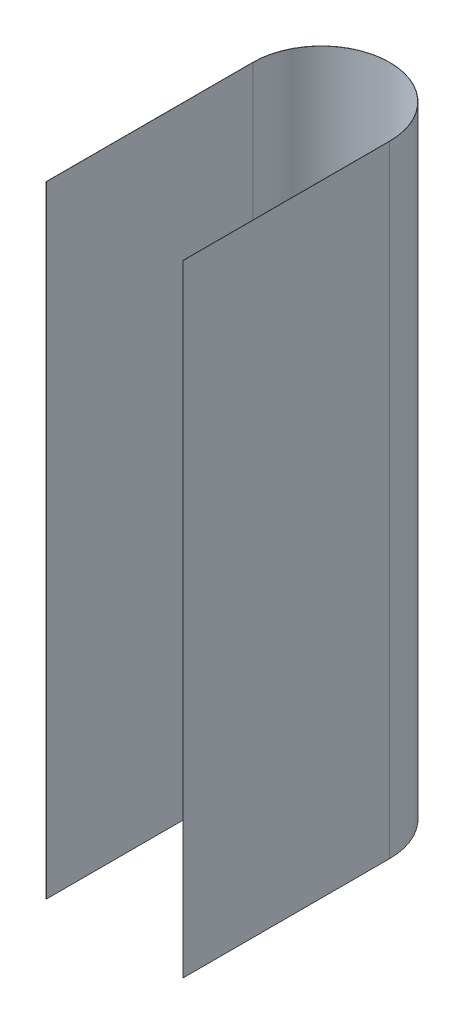
ISO-10303-21;
HEADER;
FILE_DESCRIPTION(('STEP AP214'),'2;1');
FILE_NAME('part.step','',(''),(''),'','','');
FILE_SCHEMA(('AUTOMOTIVE_DESIGN { 1 0 10303 214 1 1 1 1 }'));
ENDSEC;
DATA;
#1=APPLICATION_CONTEXT('core data for automotive mechanical design processes');
#2=APPLICATION_PROTOCOL_DEFINITION('international standard','automotive_design',2000,#1);
#3=PRODUCT_CONTEXT('',#1,'mechanical');
#4=PRODUCT('Part','Part','',(#3));
#5=PRODUCT_RELATED_PRODUCT_CATEGORY('part','',(#4));
#6=PRODUCT_DEFINITION_FORMATION('','',#4);
#7=PRODUCT_DEFINITION_CONTEXT('part definition',#1,'design');
#8=PRODUCT_DEFINITION('design','',#6,#7);
#9=PRODUCT_DEFINITION_SHAPE('','',#8);
#10=(LENGTH_UNIT() NAMED_UNIT(*) SI_UNIT(.MILLI.,.METRE.));
#11=(NAMED_UNIT(*) PLANE_ANGLE_UNIT() SI_UNIT($,.RADIAN.));
#12=(NAMED_UNIT(*) SI_UNIT($,.STERADIAN.) SOLID_ANGLE_UNIT());
#13=UNCERTAINTY_MEASURE_WITH_UNIT(LENGTH_MEASURE(1.E-05),#10,'distance_accuracy_value','');
#14=(GEOMETRIC_REPRESENTATION_CONTEXT(3) GLOBAL_UNCERTAINTY_ASSIGNED_CONTEXT((#13)) GLOBAL_UNIT_ASSIGNED_CONTEXT((#10,
#11,#12)) REPRESENTATION_CONTEXT('',''));
#15=CARTESIAN_POINT('',(0.,0.,0.));
#16=DIRECTION('',(0.,0.,1.));
#17=DIRECTION('',(1.,0.,0.));
#18=AXIS2_PLACEMENT_3D('',#15,#16,#17);
#19=CARTESIAN_POINT('',(33.,300.5,0.));
#20=DIRECTION('',(0.,-1.,0.));
#21=DIRECTION('',(0.,0.,-1.));
#22=AXIS2_PLACEMENT_3D('',#19,#20,#21);
#23=CYLINDRICAL_SURFACE('',#22,33.);
#24=CARTESIAN_POINT('',(33.,0.,0.));
#25=DIRECTION('',(0.,-1.,0.));
#26=DIRECTION('',(0.,0.,-1.));
#27=AXIS2_PLACEMENT_3D('',#24,#25,#26);
#28=CIRCLE('',#27,33.);
#29=CARTESIAN_POINT('',(0.,0.,0.));
#30=VERTEX_POINT('',#29);
#31=CARTESIAN_POINT('',(66.,0.,0.));
#32=VERTEX_POINT('',#31);
#33=EDGE_CURVE('E129',#30,#32,#28,.T.);
#34=ORIENTED_EDGE('',*,*,#33,.T.);
#35=DIRECTION('',(0.,-1.,0.));
#36=VECTOR('',#35,1.);
#37=CARTESIAN_POINT('',(66.,300.5,0.));
#38=LINE('',#37,#36);
#39=CARTESIAN_POINT('',(66.,300.5,0.));
#40=VERTEX_POINT('',#39);
#41=EDGE_CURVE('E11',#40,#32,#38,.T.);
#42=ORIENTED_EDGE('',*,*,#41,.F.);
#43=CARTESIAN_POINT('',(33.,300.5,0.));
#44=DIRECTION('',(0.,-1.,0.));
#45=DIRECTION('',(0.,0.,-1.));
#46=AXIS2_PLACEMENT_3D('',#43,#44,#45);
#47=CIRCLE('',#46,33.);
#48=CARTESIAN_POINT('',(0.,300.5,0.));
#49=VERTEX_POINT('',#48);
#50=EDGE_CURVE('E143',#49,#40,#47,.T.);
#51=ORIENTED_EDGE('',*,*,#50,.F.);
#52=DIRECTION('',(0.,-1.,0.));
#53=VECTOR('',#52,1.);
#54=CARTESIAN_POINT('',(0.,300.5,0.));
#55=LINE('',#54,#53);
#56=EDGE_CURVE('E125',#49,#30,#55,.T.);
#57=ORIENTED_EDGE('',*,*,#56,.T.);
#58=EDGE_LOOP('',(#34,#42,#51,#57));
#59=FACE_BOUND('',#58,.T.);
#60=ADVANCED_FACE('F33',(#59),#23,.F.);
#61=CARTESIAN_POINT('',(66.,300.5,0.));
#62=DIRECTION('',(1.,0.,0.));
#63=DIRECTION('',(0.,0.,-1.));
#64=AXIS2_PLACEMENT_3D('',#61,#62,#63);
#65=PLANE('',#64);
#66=DIRECTION('',(0.,0.,1.));
#67=VECTOR('',#66,1.);
#68=CARTESIAN_POINT('',(66.,0.,0.));
#69=LINE('',#68,#67);
#70=CARTESIAN_POINT('',(66.,0.,100.));
#71=VERTEX_POINT('',#70);
#72=EDGE_CURVE('E132',#32,#71,#69,.T.);
#73=ORIENTED_EDGE('',*,*,#72,.T.);
#74=DIRECTION('',(0.,-1.,0.));
#75=VECTOR('',#74,1.);
#76=CARTESIAN_POINT('',(66.,300.5,100.));
#77=LINE('',#76,#75);
#78=CARTESIAN_POINT('',(66.,300.5,100.));
#79=VERTEX_POINT('',#78);
#80=EDGE_CURVE('E41',#79,#71,#77,.T.);
#81=ORIENTED_EDGE('',*,*,#80,.F.);
#82=DIRECTION('',(0.,0.,1.));
#83=VECTOR('',#82,1.);
#84=CARTESIAN_POINT('',(66.,300.5,0.));
#85=LINE('',#84,#83);
#86=EDGE_CURVE('E92',#40,#79,#85,.T.);
#87=ORIENTED_EDGE('',*,*,#86,.F.);
#88=ORIENTED_EDGE('',*,*,#41,.T.);
#89=EDGE_LOOP('',(#73,#81,#87,#88));
#90=FACE_BOUND('',#89,.T.);
#91=ADVANCED_FACE('F178',(#90),#65,.F.);
#92=CARTESIAN_POINT('',(66.1,300.5,100.));
#93=DIRECTION('',(0.,0.,-1.));
#94=DIRECTION('',(-1.,0.,0.));
#95=AXIS2_PLACEMENT_3D('',#92,#93,#94);
#96=PLANE('',#95);
#97=DIRECTION('',(1.,0.,0.));
#98=VECTOR('',#97,1.);
#99=CARTESIAN_POINT('',(66.1,0.,100.));
#100=LINE('',#99,#98);
#101=CARTESIAN_POINT('',(66.1,0.,100.));
#102=VERTEX_POINT('',#101);
#103=EDGE_CURVE('E134',#71,#102,#100,.T.);
#104=ORIENTED_EDGE('',*,*,#103,.T.);
#105=DIRECTION('',(0.,-1.,0.));
#106=VECTOR('',#105,1.);
#107=CARTESIAN_POINT('',(66.1,300.5,100.));
#108=LINE('',#107,#106);
#109=CARTESIAN_POINT('',(66.1,300.5,100.));
#110=VERTEX_POINT('',#109);
#111=EDGE_CURVE('E150',#110,#102,#108,.T.);
#112=ORIENTED_EDGE('',*,*,#111,.F.);
#113=DIRECTION('',(1.,0.,0.));
#114=VECTOR('',#113,1.);
#115=CARTESIAN_POINT('',(66.1,300.5,100.));
#116=LINE('',#115,#114);
#117=EDGE_CURVE('E158',#79,#110,#116,.T.);
#118=ORIENTED_EDGE('',*,*,#117,.F.);
#119=ORIENTED_EDGE('',*,*,#80,.T.);
#120=EDGE_LOOP('',(#104,#112,#118,#119));
#121=FACE_BOUND('',#120,.T.);
#122=ADVANCED_FACE('F156',(#121),#96,.F.);
#123=CARTESIAN_POINT('',(66.1,300.5,0.));
#124=DIRECTION('',(-1.,0.,0.));
#125=DIRECTION('',(0.,0.,1.));
#126=AXIS2_PLACEMENT_3D('',#123,#124,#125);
#127=PLANE('',#126);
#128=DIRECTION('',(0.,0.,-1.));
#129=VECTOR('',#128,1.);
#130=CARTESIAN_POINT('',(66.1,0.,0.));
#131=LINE('',#130,#129);
#132=CARTESIAN_POINT('',(66.1,0.,0.));
#133=VERTEX_POINT('',#132);
#134=EDGE_CURVE('E136',#102,#133,#131,.T.);
#135=ORIENTED_EDGE('',*,*,#134,.T.);
#136=DIRECTION('',(0.,-1.,0.));
#137=VECTOR('',#136,1.);
#138=CARTESIAN_POINT('',(66.1,300.5,0.));
#139=LINE('',#138,#137);
#140=CARTESIAN_POINT('',(66.1,300.5,0.));
#141=VERTEX_POINT('',#140);
#142=EDGE_CURVE('E147',#141,#133,#139,.T.);
#143=ORIENTED_EDGE('',*,*,#142,.F.);
#144=DIRECTION('',(0.,0.,-1.));
#145=VECTOR('',#144,1.);
#146=CARTESIAN_POINT('',(66.1,300.5,0.));
#147=LINE('',#146,#145);
#148=EDGE_CURVE('E170',#110,#141,#147,.T.);
#149=ORIENTED_EDGE('',*,*,#148,.F.);
#150=ORIENTED_EDGE('',*,*,#111,.T.);
#151=EDGE_LOOP('',(#135,#143,#149,#150));
#152=FACE_BOUND('',#151,.T.);
#153=ADVANCED_FACE('F166',(#152),#127,.F.);
#154=CARTESIAN_POINT('',(33.,300.5,0.));
#155=DIRECTION('',(0.,-1.,0.));
#156=DIRECTION('',(0.,0.,-1.));
#157=AXIS2_PLACEMENT_3D('',#154,#155,#156);
#158=CYLINDRICAL_SURFACE('',#157,33.1);
#159=CARTESIAN_POINT('',(33.,0.,0.));
#160=DIRECTION('',(0.,1.,0.));
#161=DIRECTION('',(0.,0.,-1.));
#162=AXIS2_PLACEMENT_3D('',#159,#160,#161);
#163=CIRCLE('',#162,33.1);
#164=CARTESIAN_POINT('',(-0.100000000000003,0.,0.));
#165=VERTEX_POINT('',#164);
#166=EDGE_CURVE('E138',#133,#165,#163,.T.);
#167=ORIENTED_EDGE('',*,*,#166,.T.);
#168=DIRECTION('',(0.,-1.,0.));
#169=VECTOR('',#168,1.);
#170=CARTESIAN_POINT('',(-0.100000000000003,300.5,0.));
#171=LINE('',#170,#169);
#172=CARTESIAN_POINT('',(-0.100000000000003,300.5,0.));
#173=VERTEX_POINT('',#172);
#174=EDGE_CURVE('E120',#173,#165,#171,.T.);
#175=ORIENTED_EDGE('',*,*,#174,.F.);
#176=CARTESIAN_POINT('',(33.,300.5,0.));
#177=DIRECTION('',(0.,1.,0.));
#178=DIRECTION('',(0.,0.,-1.));
#179=AXIS2_PLACEMENT_3D('',#176,#177,#178);
#180=CIRCLE('',#179,33.1);
#181=EDGE_CURVE('E111',#141,#173,#180,.T.);
#182=ORIENTED_EDGE('',*,*,#181,.F.);
#183=ORIENTED_EDGE('',*,*,#142,.T.);
#184=EDGE_LOOP('',(#167,#175,#182,#183));
#185=FACE_BOUND('',#184,.T.);
#186=ADVANCED_FACE('F169',(#185),#158,.T.);
#187=CARTESIAN_POINT('',(-0.100000000000003,300.5,0.));
#188=DIRECTION('',(1.,0.,0.));
#189=DIRECTION('',(0.,0.,-1.));
#190=AXIS2_PLACEMENT_3D('',#187,#188,#189);
#191=PLANE('',#190);
#192=DIRECTION('',(0.,0.,1.));
#193=VECTOR('',#192,1.);
#194=CARTESIAN_POINT('',(-0.100000000000003,0.,0.));
#195=LINE('',#194,#193);
#196=CARTESIAN_POINT('',(-0.0999999999999906,0.,100.));
#197=VERTEX_POINT('',#196);
#198=EDGE_CURVE('E119',#165,#197,#195,.T.);
#199=ORIENTED_EDGE('',*,*,#198,.T.);
#200=DIRECTION('',(0.,-1.,0.));
#201=VECTOR('',#200,1.);
#202=CARTESIAN_POINT('',(-0.0999999999999906,300.5,100.));
#203=LINE('',#202,#201);
#204=CARTESIAN_POINT('',(-0.0999999999999906,300.5,100.));
#205=VERTEX_POINT('',#204);
#206=EDGE_CURVE('E116',#205,#197,#203,.T.);
#207=ORIENTED_EDGE('',*,*,#206,.F.);
#208=DIRECTION('',(0.,0.,1.));
#209=VECTOR('',#208,1.);
#210=CARTESIAN_POINT('',(-0.100000000000003,300.5,0.));
#211=LINE('',#210,#209);
#212=EDGE_CURVE('E105',#173,#205,#211,.T.);
#213=ORIENTED_EDGE('',*,*,#212,.F.);
#214=ORIENTED_EDGE('',*,*,#174,.T.);
#215=EDGE_LOOP('',(#199,#207,#213,#214));
#216=FACE_BOUND('',#215,.T.);
#217=ADVANCED_FACE('F117',(#216),#191,.F.);
#218=CARTESIAN_POINT('',(-0.0999999999999906,300.5,100.));
#219=DIRECTION('',(0.,0.,-1.));
#220=DIRECTION('',(-1.,0.,0.));
#221=AXIS2_PLACEMENT_3D('',#218,#219,#220);
#222=PLANE('',#221);
#223=DIRECTION('',(1.,0.,0.));
#224=VECTOR('',#223,1.);
#225=CARTESIAN_POINT('',(-0.0999999999999906,0.,100.));
#226=LINE('',#225,#224);
#227=CARTESIAN_POINT('',(0.,0.,100.));
#228=VERTEX_POINT('',#227);
#229=EDGE_CURVE('E78',#197,#228,#226,.T.);
#230=ORIENTED_EDGE('',*,*,#229,.T.);
#231=DIRECTION('',(0.,-1.,0.));
#232=VECTOR('',#231,1.);
#233=CARTESIAN_POINT('',(0.,300.5,100.));
#234=LINE('',#233,#232);
#235=CARTESIAN_POINT('',(0.,300.5,100.));
#236=VERTEX_POINT('',#235);
#237=EDGE_CURVE('E121',#236,#228,#234,.T.);
#238=ORIENTED_EDGE('',*,*,#237,.F.);
#239=DIRECTION('',(1.,0.,0.));
#240=VECTOR('',#239,1.);
#241=CARTESIAN_POINT('',(-0.0999999999999906,300.5,100.));
#242=LINE('',#241,#240);
#243=EDGE_CURVE('E109',#205,#236,#242,.T.);
#244=ORIENTED_EDGE('',*,*,#243,.F.);
#245=ORIENTED_EDGE('',*,*,#206,.T.);
#246=EDGE_LOOP('',(#230,#238,#244,#245));
#247=FACE_BOUND('',#246,.T.);
#248=ADVANCED_FACE('F123',(#247),#222,.F.);
#249=CARTESIAN_POINT('',(0.,300.5,0.));
#250=DIRECTION('',(-1.,0.,0.));
#251=DIRECTION('',(0.,0.,1.));
#252=AXIS2_PLACEMENT_3D('',#249,#250,#251);
#253=PLANE('',#252);
#254=DIRECTION('',(0.,0.,-1.));
#255=VECTOR('',#254,1.);
#256=CARTESIAN_POINT('',(0.,0.,0.));
#257=LINE('',#256,#255);
#258=EDGE_CURVE('E84',#228,#30,#257,.T.);
#259=ORIENTED_EDGE('',*,*,#258,.T.);
#260=ORIENTED_EDGE('',*,*,#56,.F.);
#261=DIRECTION('',(0.,0.,-1.));
#262=VECTOR('',#261,1.);
#263=CARTESIAN_POINT('',(0.,300.5,0.));
#264=LINE('',#263,#262);
#265=EDGE_CURVE('E49',#236,#49,#264,.T.);
#266=ORIENTED_EDGE('',*,*,#265,.F.);
#267=ORIENTED_EDGE('',*,*,#237,.T.);
#268=EDGE_LOOP('',(#259,#260,#266,#267));
#269=FACE_BOUND('',#268,.T.);
#270=ADVANCED_FACE('F194',(#269),#253,.F.);
#271=CARTESIAN_POINT('',(33.,300.5,0.));
#272=DIRECTION('',(0.,-1.,0.));
#273=DIRECTION('',(0.,0.,-1.));
#274=AXIS2_PLACEMENT_3D('',#271,#272,#273);
#275=PLANE('',#274);
#276=ORIENTED_EDGE('',*,*,#50,.T.);
#277=ORIENTED_EDGE('',*,*,#86,.T.);
#278=ORIENTED_EDGE('',*,*,#117,.T.);
#279=ORIENTED_EDGE('',*,*,#148,.T.);
#280=ORIENTED_EDGE('',*,*,#181,.T.);
#281=ORIENTED_EDGE('',*,*,#212,.T.);
#282=ORIENTED_EDGE('',*,*,#243,.T.);
#283=ORIENTED_EDGE('',*,*,#265,.T.);
#284=EDGE_LOOP('',(#276,#277,#278,#279,#280,#281,#282,#283));
#285=FACE_BOUND('',#284,.T.);
#286=ADVANCED_FACE('F107',(#285),#275,.F.);
#287=CARTESIAN_POINT('',(33.,0.,0.));
#288=DIRECTION('',(0.,-1.,0.));
#289=DIRECTION('',(0.,0.,-1.));
#290=AXIS2_PLACEMENT_3D('',#287,#288,#289);
#291=PLANE('',#290);
#292=ORIENTED_EDGE('',*,*,#33,.F.);
#293=ORIENTED_EDGE('',*,*,#258,.F.);
#294=ORIENTED_EDGE('',*,*,#229,.F.);
#295=ORIENTED_EDGE('',*,*,#198,.F.);
#296=ORIENTED_EDGE('',*,*,#166,.F.);
#297=ORIENTED_EDGE('',*,*,#134,.F.);
#298=ORIENTED_EDGE('',*,*,#103,.F.);
#299=ORIENTED_EDGE('',*,*,#72,.F.);
#300=EDGE_LOOP('',(#292,#293,#294,#295,#296,#297,#298,#299));
#301=FACE_BOUND('',#300,.T.);
#302=ADVANCED_FACE('F162',(#301),#291,.T.);
#303=CLOSED_SHELL('',(#60,#91,#122,#153,#186,#217,#248,#270,#286,#302));
#304=MANIFOLD_SOLID_BREP('B2',#303);
#305=ADVANCED_BREP_SHAPE_REPRESENTATION('',(#18,#304),#14);
#306=SHAPE_DEFINITION_REPRESENTATION(#9,#305);
ENDSEC;
END-ISO-10303-21;
